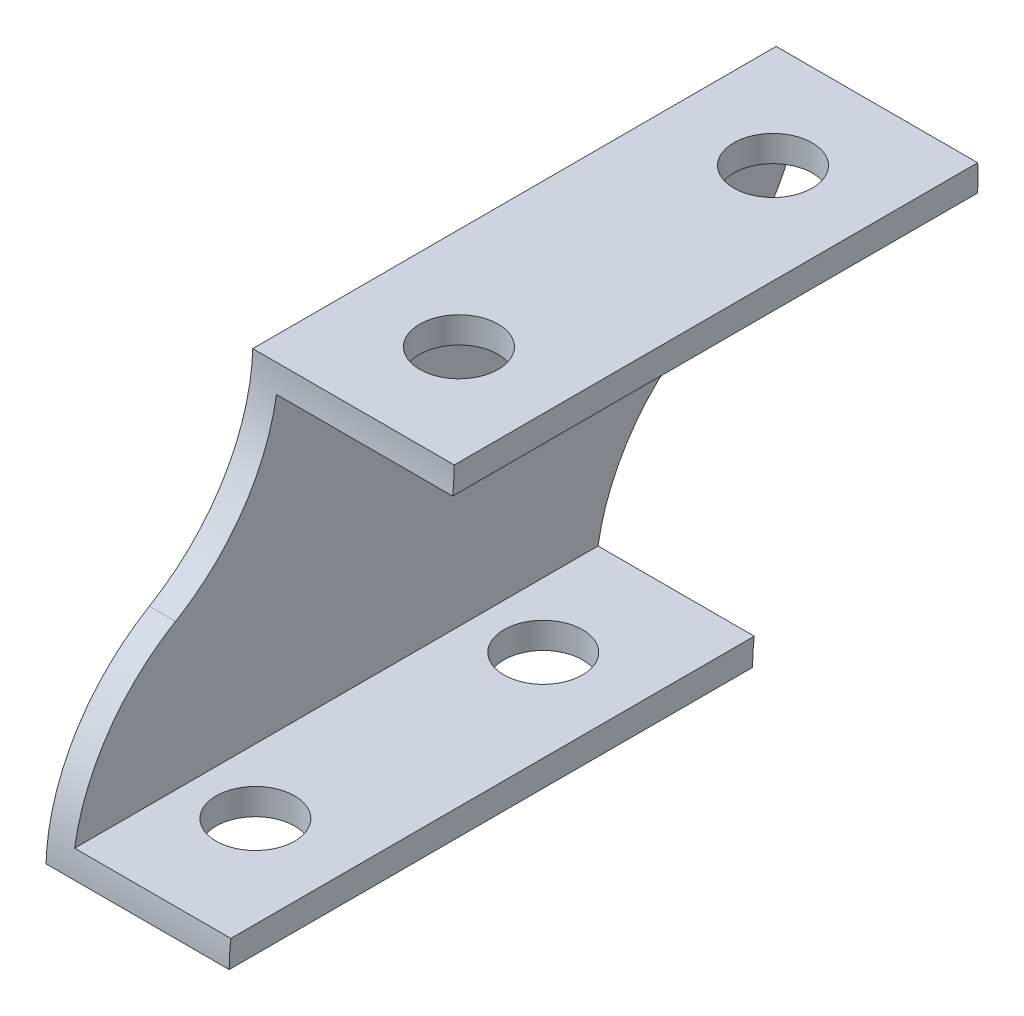
ISO-10303-21;
HEADER;
FILE_DESCRIPTION(('STEP AP214'),'2;1');
FILE_NAME('part.step','',(''),(''),'','','');
FILE_SCHEMA(('AUTOMOTIVE_DESIGN { 1 0 10303 214 1 1 1 1 }'));
ENDSEC;
DATA;
#1=APPLICATION_CONTEXT('core data for automotive mechanical design processes');
#2=APPLICATION_PROTOCOL_DEFINITION('international standard','automotive_design',2000,#1);
#3=PRODUCT_CONTEXT('',#1,'mechanical');
#4=PRODUCT('Part','Part','',(#3));
#5=PRODUCT_RELATED_PRODUCT_CATEGORY('part','',(#4));
#6=PRODUCT_DEFINITION_FORMATION('','',#4);
#7=PRODUCT_DEFINITION_CONTEXT('part definition',#1,'design');
#8=PRODUCT_DEFINITION('design','',#6,#7);
#9=PRODUCT_DEFINITION_SHAPE('','',#8);
#10=(LENGTH_UNIT() NAMED_UNIT(*) SI_UNIT(.MILLI.,.METRE.));
#11=(NAMED_UNIT(*) PLANE_ANGLE_UNIT() SI_UNIT($,.RADIAN.));
#12=(NAMED_UNIT(*) SI_UNIT($,.STERADIAN.) SOLID_ANGLE_UNIT());
#13=UNCERTAINTY_MEASURE_WITH_UNIT(LENGTH_MEASURE(1.E-05),#10,'distance_accuracy_value','');
#14=(GEOMETRIC_REPRESENTATION_CONTEXT(3) GLOBAL_UNCERTAINTY_ASSIGNED_CONTEXT((#13)) GLOBAL_UNIT_ASSIGNED_CONTEXT((#10,
#11,#12)) REPRESENTATION_CONTEXT('',''));
#15=CARTESIAN_POINT('',(0.,0.,0.));
#16=DIRECTION('',(0.,0.,1.));
#17=DIRECTION('',(1.,0.,0.));
#18=AXIS2_PLACEMENT_3D('',#15,#16,#17);
#19=CARTESIAN_POINT('',(397.423944986601,2.50000000000002,28.5));
#20=DIRECTION('',(0.,1.,0.));
#21=DIRECTION('',(-1.,0.,0.));
#22=AXIS2_PLACEMENT_3D('',#19,#20,#21);
#23=PLANE('',#22);
#24=CARTESIAN_POINT('',(400.923944986601,2.50000000000002,24.));
#25=DIRECTION('',(0.,-1.,0.));
#26=DIRECTION('',(1.,0.,0.));
#27=AXIS2_PLACEMENT_3D('',#24,#25,#26);
#28=CIRCLE('',#27,1.50000000000002);
#29=CARTESIAN_POINT('',(402.423944986601,2.50000000000002,24.));
#30=VERTEX_POINT('',#29);
#31=EDGE_CURVE('E315',#30,#30,#28,.T.);
#32=ORIENTED_EDGE('',*,*,#31,.F.);
#33=EDGE_LOOP('',(#32));
#34=FACE_BOUND('',#33,.T.);
#35=CARTESIAN_POINT('',(400.923944986601,2.50000000000002,13.));
#36=DIRECTION('',(0.,-1.,0.));
#37=DIRECTION('',(1.,0.,0.));
#38=AXIS2_PLACEMENT_3D('',#35,#36,#37);
#39=CIRCLE('',#38,1.50000000000002);
#40=CARTESIAN_POINT('',(402.423944986601,2.50000000000002,13.));
#41=VERTEX_POINT('',#40);
#42=EDGE_CURVE('E311',#41,#41,#39,.T.);
#43=ORIENTED_EDGE('',*,*,#42,.F.);
#44=EDGE_LOOP('',(#43));
#45=FACE_BOUND('',#44,.T.);
#46=DIRECTION('',(0.,0.,-1.));
#47=VECTOR('',#46,1.);
#48=CARTESIAN_POINT('',(404.423944986601,2.50000000000002,28.5));
#49=LINE('',#48,#47);
#50=CARTESIAN_POINT('',(404.423944986601,2.50000000000002,28.5));
#51=VERTEX_POINT('',#50);
#52=CARTESIAN_POINT('',(404.423944986601,2.50000000000002,8.5));
#53=VERTEX_POINT('',#52);
#54=EDGE_CURVE('E59',#51,#53,#49,.T.);
#55=ORIENTED_EDGE('',*,*,#54,.F.);
#56=DIRECTION('',(1.,0.,0.));
#57=VECTOR('',#56,1.);
#58=CARTESIAN_POINT('',(397.423944986601,2.50000000000002,28.5));
#59=LINE('',#58,#57);
#60=CARTESIAN_POINT('',(397.423944986601,2.50000000000002,28.5));
#61=VERTEX_POINT('',#60);
#62=EDGE_CURVE('E168',#61,#51,#59,.T.);
#63=ORIENTED_EDGE('',*,*,#62,.F.);
#64=DIRECTION('',(0.,0.,-1.));
#65=VECTOR('',#64,1.);
#66=CARTESIAN_POINT('',(397.423944986601,2.50000000000002,28.5));
#67=LINE('',#66,#65);
#68=CARTESIAN_POINT('',(397.423944986601,2.50000000000002,8.5));
#69=VERTEX_POINT('',#68);
#70=EDGE_CURVE('E198',#61,#69,#67,.T.);
#71=ORIENTED_EDGE('',*,*,#70,.T.);
#72=DIRECTION('',(1.,0.,0.));
#73=VECTOR('',#72,1.);
#74=CARTESIAN_POINT('',(395.524229079803,2.50000000000002,8.5));
#75=LINE('',#74,#73);
#76=EDGE_CURVE('E291',#69,#53,#75,.T.);
#77=ORIENTED_EDGE('',*,*,#76,.T.);
#78=EDGE_LOOP('',(#55,#63,#71,#77));
#79=FACE_BOUND('',#78,.T.);
#80=ADVANCED_FACE('F43',(#34,#45,#79),#23,.F.);
#81=CARTESIAN_POINT('',(405.423944986601,3.50000000000002,28.5));
#82=DIRECTION('',(0.,-1.,0.));
#83=DIRECTION('',(1.,0.,0.));
#84=AXIS2_PLACEMENT_3D('',#81,#82,#83);
#85=PLANE('',#84);
#86=CARTESIAN_POINT('',(400.923944986601,3.50000000000002,24.));
#87=DIRECTION('',(0.,-1.,0.));
#88=DIRECTION('',(1.,0.,0.));
#89=AXIS2_PLACEMENT_3D('',#86,#87,#88);
#90=CIRCLE('',#89,1.50000000000002);
#91=CARTESIAN_POINT('',(402.423944986601,3.50000000000002,24.));
#92=VERTEX_POINT('',#91);
#93=EDGE_CURVE('E146',#92,#92,#90,.T.);
#94=ORIENTED_EDGE('',*,*,#93,.T.);
#95=EDGE_LOOP('',(#94));
#96=FACE_BOUND('',#95,.T.);
#97=CARTESIAN_POINT('',(400.923944986601,3.50000000000002,13.));
#98=DIRECTION('',(0.,-1.,0.));
#99=DIRECTION('',(1.,0.,0.));
#100=AXIS2_PLACEMENT_3D('',#97,#98,#99);
#101=CIRCLE('',#100,1.50000000000002);
#102=CARTESIAN_POINT('',(402.423944986601,3.50000000000002,13.));
#103=VERTEX_POINT('',#102);
#104=EDGE_CURVE('E307',#103,#103,#101,.T.);
#105=ORIENTED_EDGE('',*,*,#104,.T.);
#106=EDGE_LOOP('',(#105));
#107=FACE_BOUND('',#106,.T.);
#108=DIRECTION('',(0.,0.,1.));
#109=VECTOR('',#108,1.);
#110=CARTESIAN_POINT('',(404.423944986601,3.50000000000002,28.5));
#111=LINE('',#110,#109);
#112=CARTESIAN_POINT('',(404.423944986601,3.50000000000002,8.43568148975157));
#113=VERTEX_POINT('',#112);
#114=CARTESIAN_POINT('',(404.423944986601,3.50000000000002,28.4368561543875));
#115=VERTEX_POINT('',#114);
#116=EDGE_CURVE('E132',#113,#115,#111,.T.);
#117=ORIENTED_EDGE('',*,*,#116,.F.);
#118=DIRECTION('',(1.,0.,0.));
#119=VECTOR('',#118,1.);
#120=CARTESIAN_POINT('',(395.524229079803,3.50000000000002,8.43568148975157));
#121=LINE('',#120,#119);
#122=CARTESIAN_POINT('',(398.45403514482,3.50000000000002,8.43568148975158));
#123=VERTEX_POINT('',#122);
#124=EDGE_CURVE('E142',#123,#113,#121,.T.);
#125=ORIENTED_EDGE('',*,*,#124,.F.);
#126=DIRECTION('',(0.,0.,-1.));
#127=VECTOR('',#126,1.);
#128=CARTESIAN_POINT('',(398.45403514482,3.50000000000002,28.5));
#129=LINE('',#128,#127);
#130=CARTESIAN_POINT('',(398.45403514482,3.50000000000002,28.4368561543875));
#131=VERTEX_POINT('',#130);
#132=EDGE_CURVE('E195',#131,#123,#129,.T.);
#133=ORIENTED_EDGE('',*,*,#132,.F.);
#134=DIRECTION('',(1.,0.,0.));
#135=VECTOR('',#134,1.);
#136=CARTESIAN_POINT('',(395.524229079803,3.50000000000002,28.4368561543875));
#137=LINE('',#136,#135);
#138=EDGE_CURVE('E144',#131,#115,#137,.T.);
#139=ORIENTED_EDGE('',*,*,#138,.T.);
#140=EDGE_LOOP('',(#117,#125,#133,#139));
#141=FACE_BOUND('',#140,.T.);
#142=ADVANCED_FACE('F140',(#96,#107,#141),#85,.F.);
#143=CARTESIAN_POINT('',(395.524229079803,2.50000000000002,20.55));
#144=DIRECTION('',(1.,0.,0.));
#145=DIRECTION('',(0.,0.,-1.));
#146=AXIS2_PLACEMENT_3D('',#143,#144,#145);
#147=CYLINDRICAL_SURFACE('',#146,7.94999999999999);
#148=CARTESIAN_POINT('',(404.423944986601,2.50000000000002,20.55));
#149=DIRECTION('',(1.,0.,0.));
#150=DIRECTION('',(0.,0.,-1.));
#151=AXIS2_PLACEMENT_3D('',#148,#149,#150);
#152=CIRCLE('',#151,7.94999999999999);
#153=EDGE_CURVE('E284',#115,#51,#152,.T.);
#154=ORIENTED_EDGE('',*,*,#153,.F.);
#155=ORIENTED_EDGE('',*,*,#138,.F.);
#156=CARTESIAN_POINT('',(398.42438447125,2.50000000000002,20.55));
#157=DIRECTION('',(-0.999560708413695,0.029637648279044,0.));
#158=DIRECTION('',(0.029637648279044,0.999560708413695,0.));
#159=AXIS2_PLACEMENT_3D('',#156,#157,#158);
#160=ELLIPSE('',#159,7.95349390295329,7.94999999999999);
#161=CARTESIAN_POINT('',(398.62452651785,9.25000000000002,24.75));
#162=VERTEX_POINT('',#161);
#163=EDGE_CURVE('E231',#162,#131,#160,.F.);
#164=ORIENTED_EDGE('',*,*,#163,.F.);
#165=DIRECTION('',(1.,0.,0.));
#166=VECTOR('',#165,1.);
#167=CARTESIAN_POINT('',(395.524229079803,9.25000000000002,24.75));
#168=LINE('',#167,#166);
#169=CARTESIAN_POINT('',(397.624087033202,9.25000000000002,24.75));
#170=VERTEX_POINT('',#169);
#171=EDGE_CURVE('E268',#170,#162,#168,.T.);
#172=ORIENTED_EDGE('',*,*,#171,.F.);
#173=CARTESIAN_POINT('',(397.423944986601,2.50000000000002,20.55));
#174=DIRECTION('',(0.999560708413695,-0.0296376482790436,0.));
#175=DIRECTION('',(0.0296376482790437,0.999560708413695,0.));
#176=AXIS2_PLACEMENT_3D('',#173,#174,#175);
#177=ELLIPSE('',#176,7.95349390295329,7.94999999999999);
#178=EDGE_CURVE('E237',#61,#170,#177,.F.);
#179=ORIENTED_EDGE('',*,*,#178,.F.);
#180=ORIENTED_EDGE('',*,*,#62,.T.);
#181=EDGE_LOOP('',(#154,#155,#164,#172,#179,#180));
#182=FACE_BOUND('',#181,.T.);
#183=ADVANCED_FACE('F339',(#182),#147,.T.);
#184=CARTESIAN_POINT('',(395.524229079803,2.50000000000002,0.694028850465125));
#185=DIRECTION('',(1.,0.,0.));
#186=DIRECTION('',(0.,0.,-1.));
#187=AXIS2_PLACEMENT_3D('',#184,#185,#186);
#188=CYLINDRICAL_SURFACE('',#187,7.80597114953488);
#189=ORIENTED_EDGE('',*,*,#124,.T.);
#190=CARTESIAN_POINT('',(404.423944986601,2.50000000000002,0.694028850465125));
#191=DIRECTION('',(1.,0.,0.));
#192=DIRECTION('',(0.,0.,-1.));
#193=AXIS2_PLACEMENT_3D('',#190,#191,#192);
#194=CIRCLE('',#193,7.80597114953488);
#195=EDGE_CURVE('E11',#113,#53,#194,.T.);
#196=ORIENTED_EDGE('',*,*,#195,.T.);
#197=ORIENTED_EDGE('',*,*,#76,.F.);
#198=CARTESIAN_POINT('',(397.423944986601,2.50000000000002,0.694028850465125));
#199=DIRECTION('',(0.999560708413695,-0.0296376482790436,0.));
#200=DIRECTION('',(0.0296376482790437,0.999560708413695,0.));
#201=AXIS2_PLACEMENT_3D('',#198,#199,#200);
#202=ELLIPSE('',#201,7.80940175401949,7.80597114953488);
#203=CARTESIAN_POINT('',(397.624087033202,9.25000000000002,4.6145754433997));
#204=VERTEX_POINT('',#203);
#205=EDGE_CURVE('E152',#69,#204,#202,.F.);
#206=ORIENTED_EDGE('',*,*,#205,.T.);
#207=DIRECTION('',(1.,0.,0.));
#208=VECTOR('',#207,1.);
#209=CARTESIAN_POINT('',(395.524229079803,9.25000000000002,4.6145754433997));
#210=LINE('',#209,#208);
#211=CARTESIAN_POINT('',(398.62452651785,9.25000000000002,4.6145754433997));
#212=VERTEX_POINT('',#211);
#213=EDGE_CURVE('E294',#204,#212,#210,.T.);
#214=ORIENTED_EDGE('',*,*,#213,.T.);
#215=CARTESIAN_POINT('',(398.42438447125,2.50000000000002,0.694028850465125));
#216=DIRECTION('',(-0.999560708413695,0.029637648279044,0.));
#217=DIRECTION('',(0.029637648279044,0.999560708413695,0.));
#218=AXIS2_PLACEMENT_3D('',#215,#216,#217);
#219=ELLIPSE('',#218,7.80940175401949,7.80597114953488);
#220=EDGE_CURVE('E52',#212,#123,#219,.F.);
#221=ORIENTED_EDGE('',*,*,#220,.T.);
#222=EDGE_LOOP('',(#189,#196,#197,#206,#214,#221));
#223=FACE_BOUND('',#222,.T.);
#224=ADVANCED_FACE('F148',(#223),#188,.F.);
#225=CARTESIAN_POINT('',(397.824229079803,16.,28.5));
#226=DIRECTION('',(0.,-1.,0.));
#227=DIRECTION('',(0.,0.,-1.));
#228=AXIS2_PLACEMENT_3D('',#225,#226,#227);
#229=PLANE('',#228);
#230=CARTESIAN_POINT('',(401.703493459328,16.,17.));
#231=DIRECTION('',(0.,1.,0.));
#232=DIRECTION('',(0.,0.,1.));
#233=AXIS2_PLACEMENT_3D('',#230,#231,#232);
#234=CIRCLE('',#233,1.50000000000002);
#235=CARTESIAN_POINT('',(401.703493459328,16.,18.5));
#236=VERTEX_POINT('',#235);
#237=EDGE_CURVE('E173',#236,#236,#234,.T.);
#238=ORIENTED_EDGE('',*,*,#237,.F.);
#239=EDGE_LOOP('',(#238));
#240=FACE_BOUND('',#239,.T.);
#241=CARTESIAN_POINT('',(401.703493459328,16.,5.));
#242=DIRECTION('',(0.,1.,0.));
#243=DIRECTION('',(0.,0.,1.));
#244=AXIS2_PLACEMENT_3D('',#241,#242,#243);
#245=CIRCLE('',#244,1.50000000000002);
#246=CARTESIAN_POINT('',(401.703493459328,16.,6.50000000000002));
#247=VERTEX_POINT('',#246);
#248=EDGE_CURVE('E169',#247,#247,#245,.T.);
#249=ORIENTED_EDGE('',*,*,#248,.F.);
#250=EDGE_LOOP('',(#249));
#251=FACE_BOUND('',#250,.T.);
#252=DIRECTION('',(0.,0.,-1.));
#253=VECTOR('',#252,1.);
#254=CARTESIAN_POINT('',(397.824229079803,16.,28.5));
#255=LINE('',#254,#253);
#256=CARTESIAN_POINT('',(397.824229079803,16.,21.));
#257=VERTEX_POINT('',#256);
#258=CARTESIAN_POINT('',(397.824229079803,16.,1.));
#259=VERTEX_POINT('',#258);
#260=EDGE_CURVE('E202',#257,#259,#255,.T.);
#261=ORIENTED_EDGE('',*,*,#260,.F.);
#262=DIRECTION('',(1.,0.,0.));
#263=VECTOR('',#262,1.);
#264=CARTESIAN_POINT('',(395.524229079803,16.,21.));
#265=LINE('',#264,#263);
#266=CARTESIAN_POINT('',(405.524229079803,16.,21.));
#267=VERTEX_POINT('',#266);
#268=EDGE_CURVE('E216',#257,#267,#265,.T.);
#269=ORIENTED_EDGE('',*,*,#268,.T.);
#270=DIRECTION('',(0.,0.,-1.));
#271=VECTOR('',#270,1.);
#272=CARTESIAN_POINT('',(405.524229079803,16.,28.5));
#273=LINE('',#272,#271);
#274=CARTESIAN_POINT('',(405.524229079803,16.,1.));
#275=VERTEX_POINT('',#274);
#276=EDGE_CURVE('E183',#267,#275,#273,.T.);
#277=ORIENTED_EDGE('',*,*,#276,.T.);
#278=DIRECTION('',(1.,0.,0.));
#279=VECTOR('',#278,1.);
#280=CARTESIAN_POINT('',(395.524229079803,16.,1.));
#281=LINE('',#280,#279);
#282=EDGE_CURVE('E66',#259,#275,#281,.T.);
#283=ORIENTED_EDGE('',*,*,#282,.F.);
#284=EDGE_LOOP('',(#261,#269,#277,#283));
#285=FACE_BOUND('',#284,.T.);
#286=ADVANCED_FACE('F45',(#240,#251,#285),#229,.F.);
#287=CARTESIAN_POINT('',(397.824229079803,16.,28.5));
#288=DIRECTION('',(0.999560708413695,-0.0296376482790436,0.));
#289=DIRECTION('',(0.0296376482790437,0.999560708413695,0.));
#290=AXIS2_PLACEMENT_3D('',#287,#288,#289);
#291=PLANE('',#290);
#292=ORIENTED_EDGE('',*,*,#70,.F.);
#293=ORIENTED_EDGE('',*,*,#178,.T.);
#294=CARTESIAN_POINT('',(397.824229079803,16.,28.95));
#295=DIRECTION('',(0.999560708413695,-0.0296376482790436,0.));
#296=DIRECTION('',(0.0296376482790437,0.999560708413695,0.));
#297=AXIS2_PLACEMENT_3D('',#294,#295,#296);
#298=ELLIPSE('',#297,7.95349390295331,7.95000000000001);
#299=EDGE_CURVE('E153',#170,#257,#298,.T.);
#300=ORIENTED_EDGE('',*,*,#299,.T.);
#301=ORIENTED_EDGE('',*,*,#260,.T.);
#302=CARTESIAN_POINT('',(397.810983177726,15.5532680886483,8.2756504403335));
#303=DIRECTION('',(0.999560708413695,-0.0296376482790436,0.));
#304=DIRECTION('',(0.0296376482790437,0.999560708413695,0.));
#305=AXIS2_PLACEMENT_3D('',#302,#303,#304);
#306=ELLIPSE('',#305,7.29255598037699,7.28935242189216);
#307=CARTESIAN_POINT('',(397.797737275649,15.1065361772965,1.));
#308=VERTEX_POINT('',#307);
#309=EDGE_CURVE('E212',#308,#259,#306,.T.);
#310=ORIENTED_EDGE('',*,*,#309,.F.);
#311=DIRECTION('',(-0.0296376482790437,-0.999560708413695,0.));
#312=VECTOR('',#311,1.);
#313=CARTESIAN_POINT('',(397.824229079803,16.,1.));
#314=LINE('',#313,#312);
#315=CARTESIAN_POINT('',(397.794578406232,15.,1.));
#316=VERTEX_POINT('',#315);
#317=EDGE_CURVE('E242',#308,#316,#314,.T.);
#318=ORIENTED_EDGE('',*,*,#317,.T.);
#319=DIRECTION('',(0.,0.,-1.));
#320=VECTOR('',#319,1.);
#321=CARTESIAN_POINT('',(397.794578406232,15.,28.5));
#322=LINE('',#321,#320);
#323=CARTESIAN_POINT('',(397.794578406232,15.,1.00732510690018));
#324=VERTEX_POINT('',#323);
#325=EDGE_CURVE('E245',#324,#316,#322,.T.);
#326=ORIENTED_EDGE('',*,*,#325,.F.);
#327=CARTESIAN_POINT('',(397.810983177726,15.5532680886483,8.2756504403335));
#328=DIRECTION('',(0.999560708413695,-0.0296376482790436,0.));
#329=DIRECTION('',(0.0296376482790437,0.999560708413695,0.));
#330=AXIS2_PLACEMENT_3D('',#327,#328,#329);
#331=ELLIPSE('',#330,7.29255598037699,7.28935242189216);
#332=EDGE_CURVE('E251',#204,#324,#331,.T.);
#333=ORIENTED_EDGE('',*,*,#332,.F.);
#334=ORIENTED_EDGE('',*,*,#205,.F.);
#335=EDGE_LOOP('',(#292,#293,#300,#301,#310,#318,#326,#333,#334));
#336=FACE_BOUND('',#335,.T.);
#337=ADVANCED_FACE('F210',(#336),#291,.F.);
#338=CARTESIAN_POINT('',(398.79501789088,15.,28.5));
#339=DIRECTION('',(-0.999560708413695,0.029637648279044,0.));
#340=DIRECTION('',(-0.029637648279044,-0.999560708413695,0.));
#341=AXIS2_PLACEMENT_3D('',#338,#339,#340);
#342=PLANE('',#341);
#343=CARTESIAN_POINT('',(398.824668564451,16.,28.95));
#344=DIRECTION('',(-0.999560708413695,0.029637648279044,0.));
#345=DIRECTION('',(0.029637648279044,0.999560708413695,0.));
#346=AXIS2_PLACEMENT_3D('',#343,#344,#345);
#347=ELLIPSE('',#346,7.9534939029533,7.95000000000001);
#348=CARTESIAN_POINT('',(398.79501789088,15.,21.0631438456125));
#349=VERTEX_POINT('',#348);
#350=EDGE_CURVE('E160',#349,#162,#347,.T.);
#351=ORIENTED_EDGE('',*,*,#350,.T.);
#352=ORIENTED_EDGE('',*,*,#163,.T.);
#353=ORIENTED_EDGE('',*,*,#132,.T.);
#354=ORIENTED_EDGE('',*,*,#220,.F.);
#355=CARTESIAN_POINT('',(398.811422662374,15.5532680886483,8.2756504403335));
#356=DIRECTION('',(-0.999560708413695,0.029637648279044,0.));
#357=DIRECTION('',(0.029637648279044,0.999560708413695,0.));
#358=AXIS2_PLACEMENT_3D('',#355,#356,#357);
#359=ELLIPSE('',#358,7.29255598037699,7.28935242189216);
#360=CARTESIAN_POINT('',(398.79501789088,15.,1.00732510690018));
#361=VERTEX_POINT('',#360);
#362=EDGE_CURVE('E248',#361,#212,#359,.T.);
#363=ORIENTED_EDGE('',*,*,#362,.F.);
#364=DIRECTION('',(0.,0.,-1.));
#365=VECTOR('',#364,1.);
#366=CARTESIAN_POINT('',(398.79501789088,15.,28.5));
#367=LINE('',#366,#365);
#368=EDGE_CURVE('E191',#349,#361,#367,.T.);
#369=ORIENTED_EDGE('',*,*,#368,.F.);
#370=EDGE_LOOP('',(#351,#352,#353,#354,#363,#369));
#371=FACE_BOUND('',#370,.T.);
#372=ADVANCED_FACE('F261',(#371),#342,.F.);
#373=CARTESIAN_POINT('',(405.524229079803,15.,28.5));
#374=DIRECTION('',(0.,1.,0.));
#375=DIRECTION('',(0.,0.,1.));
#376=AXIS2_PLACEMENT_3D('',#373,#374,#375);
#377=PLANE('',#376);
#378=DIRECTION('',(1.,0.,0.));
#379=VECTOR('',#378,1.);
#380=CARTESIAN_POINT('',(395.524229079803,15.,1.));
#381=LINE('',#380,#379);
#382=CARTESIAN_POINT('',(405.524229079803,15.,1.));
#383=VERTEX_POINT('',#382);
#384=EDGE_CURVE('E224',#316,#383,#381,.T.);
#385=ORIENTED_EDGE('',*,*,#384,.T.);
#386=DIRECTION('',(0.,0.,-1.));
#387=VECTOR('',#386,1.);
#388=CARTESIAN_POINT('',(405.524229079803,15.,28.5));
#389=LINE('',#388,#387);
#390=CARTESIAN_POINT('',(405.524229079803,15.,21.0631438456125));
#391=VERTEX_POINT('',#390);
#392=EDGE_CURVE('E187',#391,#383,#389,.T.);
#393=ORIENTED_EDGE('',*,*,#392,.F.);
#394=DIRECTION('',(1.,0.,0.));
#395=VECTOR('',#394,1.);
#396=CARTESIAN_POINT('',(395.524229079803,15.,21.0631438456125));
#397=LINE('',#396,#395);
#398=EDGE_CURVE('E254',#391,#349,#397,.F.);
#399=ORIENTED_EDGE('',*,*,#398,.T.);
#400=ORIENTED_EDGE('',*,*,#368,.T.);
#401=DIRECTION('',(1.,0.,0.));
#402=VECTOR('',#401,1.);
#403=CARTESIAN_POINT('',(395.524229079803,15.,1.00732510690018));
#404=LINE('',#403,#402);
#405=EDGE_CURVE('E297',#324,#361,#404,.T.);
#406=ORIENTED_EDGE('',*,*,#405,.F.);
#407=ORIENTED_EDGE('',*,*,#325,.T.);
#408=EDGE_LOOP('',(#385,#393,#399,#400,#406,#407));
#409=FACE_BOUND('',#408,.T.);
#410=CARTESIAN_POINT('',(401.703493459328,15.,17.));
#411=DIRECTION('',(0.,1.,0.));
#412=DIRECTION('',(0.,0.,1.));
#413=AXIS2_PLACEMENT_3D('',#410,#411,#412);
#414=CIRCLE('',#413,1.50000000000002);
#415=CARTESIAN_POINT('',(401.703493459328,15.,18.5));
#416=VERTEX_POINT('',#415);
#417=EDGE_CURVE('E157',#416,#416,#414,.T.);
#418=ORIENTED_EDGE('',*,*,#417,.T.);
#419=EDGE_LOOP('',(#418));
#420=FACE_BOUND('',#419,.T.);
#421=CARTESIAN_POINT('',(401.703493459328,15.,5.));
#422=DIRECTION('',(0.,1.,0.));
#423=DIRECTION('',(0.,0.,1.));
#424=AXIS2_PLACEMENT_3D('',#421,#422,#423);
#425=CIRCLE('',#424,1.50000000000002);
#426=CARTESIAN_POINT('',(401.703493459328,15.,6.50000000000002));
#427=VERTEX_POINT('',#426);
#428=EDGE_CURVE('E164',#427,#427,#425,.T.);
#429=ORIENTED_EDGE('',*,*,#428,.T.);
#430=EDGE_LOOP('',(#429));
#431=FACE_BOUND('',#430,.T.);
#432=ADVANCED_FACE('F271',(#409,#420,#431),#377,.F.);
#433=CARTESIAN_POINT('',(405.524229079803,16.,28.5));
#434=DIRECTION('',(-1.,0.,0.));
#435=DIRECTION('',(0.,0.,1.));
#436=AXIS2_PLACEMENT_3D('',#433,#434,#435);
#437=PLANE('',#436);
#438=ORIENTED_EDGE('',*,*,#276,.F.);
#439=CARTESIAN_POINT('',(405.524229079803,16.,28.95));
#440=DIRECTION('',(1.,0.,0.));
#441=DIRECTION('',(0.,0.,-1.));
#442=AXIS2_PLACEMENT_3D('',#439,#440,#441);
#443=CIRCLE('',#442,7.95000000000001);
#444=EDGE_CURVE('E278',#391,#267,#443,.T.);
#445=ORIENTED_EDGE('',*,*,#444,.F.);
#446=ORIENTED_EDGE('',*,*,#392,.T.);
#447=DIRECTION('',(0.,-1.,0.));
#448=VECTOR('',#447,1.);
#449=CARTESIAN_POINT('',(405.524229079803,0.,1.));
#450=LINE('',#449,#448);
#451=CARTESIAN_POINT('',(405.524229079803,15.1065361772965,1.));
#452=VERTEX_POINT('',#451);
#453=EDGE_CURVE('E220',#452,#383,#450,.T.);
#454=ORIENTED_EDGE('',*,*,#453,.F.);
#455=CARTESIAN_POINT('',(405.524229079803,15.5532680886483,8.2756504403335));
#456=DIRECTION('',(1.,0.,0.));
#457=DIRECTION('',(0.,0.,-1.));
#458=AXIS2_PLACEMENT_3D('',#455,#456,#457);
#459=CIRCLE('',#458,7.28935242189216);
#460=EDGE_CURVE('E227',#452,#275,#459,.T.);
#461=ORIENTED_EDGE('',*,*,#460,.T.);
#462=EDGE_LOOP('',(#438,#445,#446,#454,#461));
#463=FACE_BOUND('',#462,.T.);
#464=ADVANCED_FACE('F277',(#463),#437,.F.);
#465=CARTESIAN_POINT('',(401.703493459328,15.,17.));
#466=DIRECTION('',(0.,1.,0.));
#467=DIRECTION('',(0.,0.,1.));
#468=AXIS2_PLACEMENT_3D('',#465,#466,#467);
#469=CYLINDRICAL_SURFACE('',#468,1.50000000000002);
#470=ORIENTED_EDGE('',*,*,#417,.F.);
#471=EDGE_LOOP('',(#470));
#472=FACE_BOUND('',#471,.T.);
#473=ORIENTED_EDGE('',*,*,#237,.T.);
#474=EDGE_LOOP('',(#473));
#475=FACE_BOUND('',#474,.T.);
#476=ADVANCED_FACE('F362',(#472,#475),#469,.F.);
#477=CARTESIAN_POINT('',(401.703493459328,15.,5.));
#478=DIRECTION('',(0.,1.,0.));
#479=DIRECTION('',(0.,0.,1.));
#480=AXIS2_PLACEMENT_3D('',#477,#478,#479);
#481=CYLINDRICAL_SURFACE('',#480,1.50000000000002);
#482=ORIENTED_EDGE('',*,*,#428,.F.);
#483=EDGE_LOOP('',(#482));
#484=FACE_BOUND('',#483,.T.);
#485=ORIENTED_EDGE('',*,*,#248,.T.);
#486=EDGE_LOOP('',(#485));
#487=FACE_BOUND('',#486,.T.);
#488=ADVANCED_FACE('F353',(#484,#487),#481,.F.);
#489=CARTESIAN_POINT('',(395.524229079803,16.,28.95));
#490=DIRECTION('',(1.,0.,0.));
#491=DIRECTION('',(0.,0.,-1.));
#492=AXIS2_PLACEMENT_3D('',#489,#490,#491);
#493=CYLINDRICAL_SURFACE('',#492,7.95000000000001);
#494=ORIENTED_EDGE('',*,*,#171,.T.);
#495=ORIENTED_EDGE('',*,*,#350,.F.);
#496=ORIENTED_EDGE('',*,*,#398,.F.);
#497=ORIENTED_EDGE('',*,*,#444,.T.);
#498=ORIENTED_EDGE('',*,*,#268,.F.);
#499=ORIENTED_EDGE('',*,*,#299,.F.);
#500=EDGE_LOOP('',(#494,#495,#496,#497,#498,#499));
#501=FACE_BOUND('',#500,.T.);
#502=ADVANCED_FACE('F265',(#501),#493,.F.);
#503=CARTESIAN_POINT('',(395.524229079803,15.5532680886483,8.2756504403335));
#504=DIRECTION('',(1.,0.,0.));
#505=DIRECTION('',(0.,0.,-1.));
#506=AXIS2_PLACEMENT_3D('',#503,#504,#505);
#507=CYLINDRICAL_SURFACE('',#506,7.28935242189216);
#508=ORIENTED_EDGE('',*,*,#332,.T.);
#509=ORIENTED_EDGE('',*,*,#405,.T.);
#510=ORIENTED_EDGE('',*,*,#362,.T.);
#511=ORIENTED_EDGE('',*,*,#213,.F.);
#512=EDGE_LOOP('',(#508,#509,#510,#511));
#513=FACE_BOUND('',#512,.T.);
#514=ADVANCED_FACE('F345',(#513),#507,.T.);
#515=CARTESIAN_POINT('',(395.524229079803,0.,1.));
#516=DIRECTION('',(0.,0.,1.));
#517=DIRECTION('',(0.,-1.,0.));
#518=AXIS2_PLACEMENT_3D('',#515,#516,#517);
#519=PLANE('',#518);
#520=DIRECTION('',(1.,0.,0.));
#521=VECTOR('',#520,1.);
#522=CARTESIAN_POINT('',(395.524229079803,15.1065361772965,1.));
#523=LINE('',#522,#521);
#524=EDGE_CURVE('E219',#308,#452,#523,.T.);
#525=ORIENTED_EDGE('',*,*,#524,.T.);
#526=ORIENTED_EDGE('',*,*,#453,.T.);
#527=ORIENTED_EDGE('',*,*,#384,.F.);
#528=ORIENTED_EDGE('',*,*,#317,.F.);
#529=EDGE_LOOP('',(#525,#526,#527,#528));
#530=FACE_BOUND('',#529,.T.);
#531=ADVANCED_FACE('F280',(#530),#519,.F.);
#532=CARTESIAN_POINT('',(395.524229079803,15.5532680886483,8.2756504403335));
#533=DIRECTION('',(1.,0.,0.));
#534=DIRECTION('',(0.,0.,-1.));
#535=AXIS2_PLACEMENT_3D('',#532,#533,#534);
#536=CYLINDRICAL_SURFACE('',#535,7.28935242189216);
#537=ORIENTED_EDGE('',*,*,#309,.T.);
#538=ORIENTED_EDGE('',*,*,#282,.T.);
#539=ORIENTED_EDGE('',*,*,#460,.F.);
#540=ORIENTED_EDGE('',*,*,#524,.F.);
#541=EDGE_LOOP('',(#537,#538,#539,#540));
#542=FACE_BOUND('',#541,.T.);
#543=ADVANCED_FACE('F282',(#542),#536,.T.);
#544=CARTESIAN_POINT('',(404.423944986601,0.,0.));
#545=DIRECTION('',(1.,0.,0.));
#546=DIRECTION('',(0.,0.,-1.));
#547=AXIS2_PLACEMENT_3D('',#544,#545,#546);
#548=PLANE('',#547);
#549=ORIENTED_EDGE('',*,*,#153,.T.);
#550=ORIENTED_EDGE('',*,*,#54,.T.);
#551=ORIENTED_EDGE('',*,*,#195,.F.);
#552=ORIENTED_EDGE('',*,*,#116,.T.);
#553=EDGE_LOOP('',(#549,#550,#551,#552));
#554=FACE_BOUND('',#553,.T.);
#555=ADVANCED_FACE('F131',(#554),#548,.T.);
#556=CARTESIAN_POINT('',(400.923944986601,3.50000000000002,13.));
#557=DIRECTION('',(0.,-1.,0.));
#558=DIRECTION('',(1.,0.,0.));
#559=AXIS2_PLACEMENT_3D('',#556,#557,#558);
#560=CYLINDRICAL_SURFACE('',#559,1.50000000000002);
#561=ORIENTED_EDGE('',*,*,#104,.F.);
#562=EDGE_LOOP('',(#561));
#563=FACE_BOUND('',#562,.T.);
#564=ORIENTED_EDGE('',*,*,#42,.T.);
#565=EDGE_LOOP('',(#564));
#566=FACE_BOUND('',#565,.T.);
#567=ADVANCED_FACE('F328',(#563,#566),#560,.F.);
#568=CARTESIAN_POINT('',(400.923944986601,3.50000000000002,24.));
#569=DIRECTION('',(0.,-1.,0.));
#570=DIRECTION('',(1.,0.,0.));
#571=AXIS2_PLACEMENT_3D('',#568,#569,#570);
#572=CYLINDRICAL_SURFACE('',#571,1.50000000000002);
#573=ORIENTED_EDGE('',*,*,#93,.F.);
#574=EDGE_LOOP('',(#573));
#575=FACE_BOUND('',#574,.T.);
#576=ORIENTED_EDGE('',*,*,#31,.T.);
#577=EDGE_LOOP('',(#576));
#578=FACE_BOUND('',#577,.T.);
#579=ADVANCED_FACE('F325',(#575,#578),#572,.F.);
#580=CLOSED_SHELL('',(#80,#142,#183,#224,#286,#337,#372,#432,#464,#476,#488,#502,#514,#531,#543,
#555,#567,#579));
#581=MANIFOLD_SOLID_BREP('B2',#580);
#582=ADVANCED_BREP_SHAPE_REPRESENTATION('',(#18,#581),#14);
#583=SHAPE_DEFINITION_REPRESENTATION(#9,#582);
ENDSEC;
END-ISO-10303-21;
